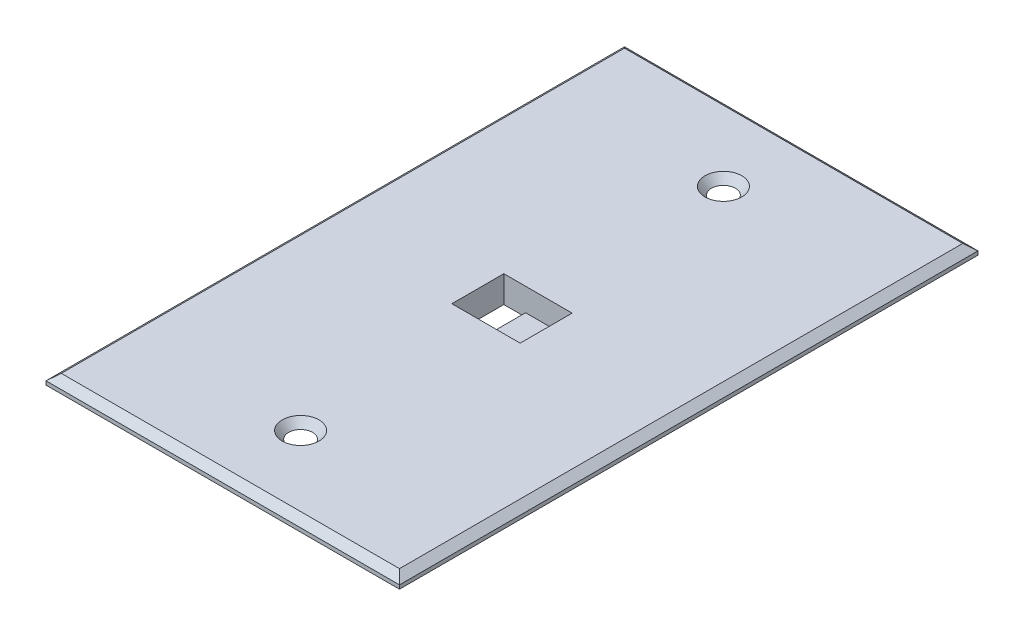
ISO-10303-21;
HEADER;
FILE_DESCRIPTION(('STEP AP214'),'2;1');
FILE_NAME('part.step','',(''),(''),'','','');
FILE_SCHEMA(('AUTOMOTIVE_DESIGN { 1 0 10303 214 1 1 1 1 }'));
ENDSEC;
DATA;
#1=APPLICATION_CONTEXT('core data for automotive mechanical design processes');
#2=APPLICATION_PROTOCOL_DEFINITION('international standard','automotive_design',2000,#1);
#3=PRODUCT_CONTEXT('',#1,'mechanical');
#4=PRODUCT('Part','Part','',(#3));
#5=PRODUCT_RELATED_PRODUCT_CATEGORY('part','',(#4));
#6=PRODUCT_DEFINITION_FORMATION('','',#4);
#7=PRODUCT_DEFINITION_CONTEXT('part definition',#1,'design');
#8=PRODUCT_DEFINITION('design','',#6,#7);
#9=PRODUCT_DEFINITION_SHAPE('','',#8);
#10=(LENGTH_UNIT() NAMED_UNIT(*) SI_UNIT(.MILLI.,.METRE.));
#11=(NAMED_UNIT(*) PLANE_ANGLE_UNIT() SI_UNIT($,.RADIAN.));
#12=(NAMED_UNIT(*) SI_UNIT($,.STERADIAN.) SOLID_ANGLE_UNIT());
#13=UNCERTAINTY_MEASURE_WITH_UNIT(LENGTH_MEASURE(1.E-05),#10,'distance_accuracy_value','');
#14=(GEOMETRIC_REPRESENTATION_CONTEXT(3) GLOBAL_UNCERTAINTY_ASSIGNED_CONTEXT((#13)) GLOBAL_UNIT_ASSIGNED_CONTEXT((#10,
#11,#12)) REPRESENTATION_CONTEXT('',''));
#15=CARTESIAN_POINT('',(0.,0.,0.));
#16=DIRECTION('',(0.,0.,1.));
#17=DIRECTION('',(1.,0.,0.));
#18=AXIS2_PLACEMENT_3D('',#15,#16,#17);
#19=CARTESIAN_POINT('',(6.7,-2.5,-5.1));
#20=DIRECTION('',(1.,0.,0.));
#21=DIRECTION('',(0.,0.,-1.));
#22=AXIS2_PLACEMENT_3D('',#19,#20,#21);
#23=PLANE('',#22);
#24=DIRECTION('',(0.,0.,-1.));
#25=VECTOR('',#24,1.);
#26=CARTESIAN_POINT('',(6.7,2.,-5.1));
#27=LINE('',#26,#25);
#28=CARTESIAN_POINT('',(6.7,2.,5.1));
#29=VERTEX_POINT('',#28);
#30=CARTESIAN_POINT('',(6.7,2.,-5.1));
#31=VERTEX_POINT('',#30);
#32=EDGE_CURVE('E267',#29,#31,#27,.T.);
#33=ORIENTED_EDGE('',*,*,#32,.T.);
#34=DIRECTION('',(0.,1.,0.));
#35=VECTOR('',#34,1.);
#36=CARTESIAN_POINT('',(6.7,-2.5,-5.1));
#37=LINE('',#36,#35);
#38=CARTESIAN_POINT('',(6.7,-2.5,-5.1));
#39=VERTEX_POINT('',#38);
#40=EDGE_CURVE('E284',#39,#31,#37,.T.);
#41=ORIENTED_EDGE('',*,*,#40,.F.);
#42=DIRECTION('',(0.,0.,-1.));
#43=VECTOR('',#42,1.);
#44=CARTESIAN_POINT('',(6.7,-2.5,-5.1));
#45=LINE('',#44,#43);
#46=CARTESIAN_POINT('',(6.7,-2.5,5.1));
#47=VERTEX_POINT('',#46);
#48=EDGE_CURVE('E277',#47,#39,#45,.T.);
#49=ORIENTED_EDGE('',*,*,#48,.F.);
#50=DIRECTION('',(0.,1.,0.));
#51=VECTOR('',#50,1.);
#52=CARTESIAN_POINT('',(6.7,-2.5,5.1));
#53=LINE('',#52,#51);
#54=EDGE_CURVE('E285',#47,#29,#53,.T.);
#55=ORIENTED_EDGE('',*,*,#54,.T.);
#56=EDGE_LOOP('',(#33,#41,#49,#55));
#57=FACE_BOUND('',#56,.T.);
#58=DIRECTION('',(0.,-1.,0.));
#59=VECTOR('',#58,1.);
#60=CARTESIAN_POINT('',(6.7,0.3,-0.637503978051514));
#61=LINE('',#60,#59);
#62=CARTESIAN_POINT('',(6.7,0.96082176619916,-0.637503978051514));
#63=VERTEX_POINT('',#62);
#64=CARTESIAN_POINT('',(6.7,0.299999999999999,-0.637503978051514));
#65=VERTEX_POINT('',#64);
#66=EDGE_CURVE('E230',#63,#65,#61,.T.);
#67=ORIENTED_EDGE('',*,*,#66,.F.);
#68=DIRECTION('',(0.,0.,-1.));
#69=VECTOR('',#68,1.);
#70=CARTESIAN_POINT('',(6.7,0.96082176619916,-0.637503978051514));
#71=LINE('',#70,#69);
#72=CARTESIAN_POINT('',(6.7,0.96082176619916,0.545665972342845));
#73=VERTEX_POINT('',#72);
#74=EDGE_CURVE('E235',#73,#63,#71,.T.);
#75=ORIENTED_EDGE('',*,*,#74,.F.);
#76=DIRECTION('',(0.,1.,0.));
#77=VECTOR('',#76,1.);
#78=CARTESIAN_POINT('',(6.7,0.3,0.545665972342845));
#79=LINE('',#78,#77);
#80=CARTESIAN_POINT('',(6.7,0.3,0.545665972342845));
#81=VERTEX_POINT('',#80);
#82=EDGE_CURVE('E241',#81,#73,#79,.T.);
#83=ORIENTED_EDGE('',*,*,#82,.F.);
#84=DIRECTION('',(0.,0.,1.));
#85=VECTOR('',#84,1.);
#86=CARTESIAN_POINT('',(6.7,0.3,-0.637503978051514));
#87=LINE('',#86,#85);
#88=EDGE_CURVE('E238',#65,#81,#87,.T.);
#89=ORIENTED_EDGE('',*,*,#88,.F.);
#90=EDGE_LOOP('',(#67,#75,#83,#89));
#91=FACE_BOUND('',#90,.T.);
#92=ADVANCED_FACE('F41',(#57,#91),#23,.F.);
#93=CARTESIAN_POINT('',(0.,-2.5,0.));
#94=DIRECTION('',(0.,-1.,0.));
#95=DIRECTION('',(0.,0.,-1.));
#96=AXIS2_PLACEMENT_3D('',#93,#94,#95);
#97=PLANE('',#96);
#98=DIRECTION('',(-1.,0.,0.));
#99=VECTOR('',#98,1.);
#100=CARTESIAN_POINT('',(-6.7,-2.5,-5.1));
#101=LINE('',#100,#99);
#102=CARTESIAN_POINT('',(-2.43682929408481,-2.5,-5.1));
#103=VERTEX_POINT('',#102);
#104=EDGE_CURVE('E280',#39,#103,#101,.T.);
#105=ORIENTED_EDGE('',*,*,#104,.T.);
#106=DIRECTION('',(0.,0.,1.));
#107=VECTOR('',#106,1.);
#108=CARTESIAN_POINT('',(-2.43682929408481,-2.5,0.));
#109=LINE('',#108,#107);
#110=CARTESIAN_POINT('',(-2.43682929408481,-2.5,5.1));
#111=VERTEX_POINT('',#110);
#112=EDGE_CURVE('E208',#103,#111,#109,.T.);
#113=ORIENTED_EDGE('',*,*,#112,.T.);
#114=DIRECTION('',(1.,0.,0.));
#115=VECTOR('',#114,1.);
#116=CARTESIAN_POINT('',(-6.7,-2.5,5.1));
#117=LINE('',#116,#115);
#118=EDGE_CURVE('E282',#111,#47,#117,.T.);
#119=ORIENTED_EDGE('',*,*,#118,.T.);
#120=ORIENTED_EDGE('',*,*,#48,.T.);
#121=EDGE_LOOP('',(#105,#113,#119,#120));
#122=FACE_BOUND('',#121,.T.);
#123=ADVANCED_FACE('F425',(#122),#97,.F.);
#124=CARTESIAN_POINT('',(-34.675,2.,56.75));
#125=DIRECTION('',(0.,0.,-1.));
#126=DIRECTION('',(-1.,0.,0.));
#127=AXIS2_PLACEMENT_3D('',#124,#125,#126);
#128=PLANE('',#127);
#129=DIRECTION('',(0.,-1.,0.));
#130=VECTOR('',#129,1.);
#131=CARTESIAN_POINT('',(34.675,2.,56.75));
#132=LINE('',#131,#130);
#133=CARTESIAN_POINT('',(34.675,0.741350553234083,56.75));
#134=VERTEX_POINT('',#133);
#135=CARTESIAN_POINT('',(34.675,0.,56.75));
#136=VERTEX_POINT('',#135);
#137=EDGE_CURVE('E362',#134,#136,#132,.T.);
#138=ORIENTED_EDGE('',*,*,#137,.F.);
#139=DIRECTION('',(-1.,0.,0.));
#140=VECTOR('',#139,1.);
#141=CARTESIAN_POINT('',(-34.675,0.741350553234083,56.75));
#142=LINE('',#141,#140);
#143=CARTESIAN_POINT('',(-34.675,0.741350553234083,56.75));
#144=VERTEX_POINT('',#143);
#145=EDGE_CURVE('E384',#134,#144,#142,.T.);
#146=ORIENTED_EDGE('',*,*,#145,.T.);
#147=DIRECTION('',(0.,-1.,0.));
#148=VECTOR('',#147,1.);
#149=CARTESIAN_POINT('',(-34.675,2.,56.75));
#150=LINE('',#149,#148);
#151=CARTESIAN_POINT('',(-34.675,0.,56.75));
#152=VERTEX_POINT('',#151);
#153=EDGE_CURVE('E356',#144,#152,#150,.T.);
#154=ORIENTED_EDGE('',*,*,#153,.T.);
#155=DIRECTION('',(1.,0.,0.));
#156=VECTOR('',#155,1.);
#157=CARTESIAN_POINT('',(-34.675,0.,56.75));
#158=LINE('',#157,#156);
#159=EDGE_CURVE('E343',#152,#136,#158,.T.);
#160=ORIENTED_EDGE('',*,*,#159,.T.);
#161=EDGE_LOOP('',(#138,#146,#154,#160));
#162=FACE_BOUND('',#161,.T.);
#163=ADVANCED_FACE('F431',(#162),#128,.F.);
#164=CARTESIAN_POINT('',(34.675,2.,-56.75));
#165=DIRECTION('',(1.,0.,0.));
#166=DIRECTION('',(0.,0.,-1.));
#167=AXIS2_PLACEMENT_3D('',#164,#165,#166);
#168=PLANE('',#167);
#169=DIRECTION('',(0.,-1.,0.));
#170=VECTOR('',#169,1.);
#171=CARTESIAN_POINT('',(34.675,2.,-56.75));
#172=LINE('',#171,#170);
#173=CARTESIAN_POINT('',(34.675,0.741350553234083,-56.75));
#174=VERTEX_POINT('',#173);
#175=CARTESIAN_POINT('',(34.675,0.,-56.75));
#176=VERTEX_POINT('',#175);
#177=EDGE_CURVE('E360',#174,#176,#172,.T.);
#178=ORIENTED_EDGE('',*,*,#177,.F.);
#179=DIRECTION('',(0.,0.,1.));
#180=VECTOR('',#179,1.);
#181=CARTESIAN_POINT('',(34.675,0.741350553234083,56.75));
#182=LINE('',#181,#180);
#183=EDGE_CURVE('E382',#174,#134,#182,.T.);
#184=ORIENTED_EDGE('',*,*,#183,.T.);
#185=ORIENTED_EDGE('',*,*,#137,.T.);
#186=DIRECTION('',(0.,0.,1.));
#187=VECTOR('',#186,1.);
#188=CARTESIAN_POINT('',(34.675,0.,-56.75));
#189=LINE('',#188,#187);
#190=EDGE_CURVE('E346',#176,#136,#189,.T.);
#191=ORIENTED_EDGE('',*,*,#190,.F.);
#192=EDGE_LOOP('',(#178,#184,#185,#191));
#193=FACE_BOUND('',#192,.T.);
#194=ADVANCED_FACE('F491',(#193),#168,.T.);
#195=CARTESIAN_POINT('',(-34.675,2.,-56.75));
#196=DIRECTION('',(0.,0.,-1.));
#197=DIRECTION('',(-1.,0.,0.));
#198=AXIS2_PLACEMENT_3D('',#195,#196,#197);
#199=PLANE('',#198);
#200=DIRECTION('',(0.,-1.,0.));
#201=VECTOR('',#200,1.);
#202=CARTESIAN_POINT('',(-34.675,2.,-56.75));
#203=LINE('',#202,#201);
#204=CARTESIAN_POINT('',(-34.675,0.741350553234083,-56.75));
#205=VERTEX_POINT('',#204);
#206=CARTESIAN_POINT('',(-34.675,0.,-56.75));
#207=VERTEX_POINT('',#206);
#208=EDGE_CURVE('E358',#205,#207,#203,.T.);
#209=ORIENTED_EDGE('',*,*,#208,.F.);
#210=DIRECTION('',(1.,0.,0.));
#211=VECTOR('',#210,1.);
#212=CARTESIAN_POINT('',(34.675,0.741350553234083,-56.75));
#213=LINE('',#212,#211);
#214=EDGE_CURVE('E379',#205,#174,#213,.T.);
#215=ORIENTED_EDGE('',*,*,#214,.T.);
#216=ORIENTED_EDGE('',*,*,#177,.T.);
#217=DIRECTION('',(1.,0.,0.));
#218=VECTOR('',#217,1.);
#219=CARTESIAN_POINT('',(-34.675,0.,-56.75));
#220=LINE('',#219,#218);
#221=EDGE_CURVE('E350',#207,#176,#220,.T.);
#222=ORIENTED_EDGE('',*,*,#221,.F.);
#223=EDGE_LOOP('',(#209,#215,#216,#222));
#224=FACE_BOUND('',#223,.T.);
#225=ADVANCED_FACE('F487',(#224),#199,.T.);
#226=CARTESIAN_POINT('',(-34.675,2.,-56.75));
#227=DIRECTION('',(1.,0.,0.));
#228=DIRECTION('',(0.,0.,-1.));
#229=AXIS2_PLACEMENT_3D('',#226,#227,#228);
#230=PLANE('',#229);
#231=ORIENTED_EDGE('',*,*,#153,.F.);
#232=DIRECTION('',(0.,0.,-1.));
#233=VECTOR('',#232,1.);
#234=CARTESIAN_POINT('',(-34.675,0.741350553234083,-56.75));
#235=LINE('',#234,#233);
#236=EDGE_CURVE('E386',#144,#205,#235,.T.);
#237=ORIENTED_EDGE('',*,*,#236,.T.);
#238=ORIENTED_EDGE('',*,*,#208,.T.);
#239=DIRECTION('',(0.,0.,1.));
#240=VECTOR('',#239,1.);
#241=CARTESIAN_POINT('',(-34.675,0.,-56.75));
#242=LINE('',#241,#240);
#243=EDGE_CURVE('E353',#207,#152,#242,.T.);
#244=ORIENTED_EDGE('',*,*,#243,.T.);
#245=EDGE_LOOP('',(#231,#237,#238,#244));
#246=FACE_BOUND('',#245,.T.);
#247=ADVANCED_FACE('F479',(#246),#230,.F.);
#248=CARTESIAN_POINT('',(0.,2.,0.));
#249=DIRECTION('',(0.,-1.,0.));
#250=DIRECTION('',(0.,0.,-1.));
#251=AXIS2_PLACEMENT_3D('',#248,#249,#250);
#252=PLANE('',#251);
#253=DIRECTION('',(-1.,0.,0.));
#254=VECTOR('',#253,1.);
#255=CARTESIAN_POINT('',(-6.7,2.,-5.1));
#256=LINE('',#255,#254);
#257=CARTESIAN_POINT('',(-6.7,2.,-5.1));
#258=VERTEX_POINT('',#257);
#259=EDGE_CURVE('E270',#31,#258,#256,.T.);
#260=ORIENTED_EDGE('',*,*,#259,.F.);
#261=ORIENTED_EDGE('',*,*,#32,.F.);
#262=DIRECTION('',(1.,0.,0.));
#263=VECTOR('',#262,1.);
#264=CARTESIAN_POINT('',(-6.7,2.,5.1));
#265=LINE('',#264,#263);
#266=CARTESIAN_POINT('',(-6.7,2.,5.1));
#267=VERTEX_POINT('',#266);
#268=EDGE_CURVE('E275',#267,#29,#265,.T.);
#269=ORIENTED_EDGE('',*,*,#268,.F.);
#270=DIRECTION('',(0.,0.,1.));
#271=VECTOR('',#270,1.);
#272=CARTESIAN_POINT('',(-6.7,2.,-5.1));
#273=LINE('',#272,#271);
#274=EDGE_CURVE('E272',#258,#267,#273,.T.);
#275=ORIENTED_EDGE('',*,*,#274,.F.);
#276=EDGE_LOOP('',(#260,#261,#269,#275));
#277=FACE_BOUND('',#276,.T.);
#278=CARTESIAN_POINT('',(0.,2.,41.4760026959192));
#279=DIRECTION('',(0.,-1.,0.));
#280=DIRECTION('',(0.,0.,-1.));
#281=AXIS2_PLACEMENT_3D('',#278,#279,#280);
#282=CIRCLE('',#281,3.60864944676592);
#283=CARTESIAN_POINT('',(0.,2.,45.0846521426851));
#284=VERTEX_POINT('',#283);
#285=EDGE_CURVE('E376',#284,#284,#282,.T.);
#286=ORIENTED_EDGE('',*,*,#285,.T.);
#287=EDGE_LOOP('',(#286));
#288=FACE_BOUND('',#287,.T.);
#289=CARTESIAN_POINT('',(0.,2.,-41.4760026959192));
#290=DIRECTION('',(0.,-1.,0.));
#291=DIRECTION('',(0.,0.,-1.));
#292=AXIS2_PLACEMENT_3D('',#289,#290,#291);
#293=CIRCLE('',#292,3.60864944676592);
#294=CARTESIAN_POINT('',(0.,2.,-37.8673532491533));
#295=VERTEX_POINT('',#294);
#296=EDGE_CURVE('E373',#295,#295,#293,.T.);
#297=ORIENTED_EDGE('',*,*,#296,.T.);
#298=EDGE_LOOP('',(#297));
#299=FACE_BOUND('',#298,.T.);
#300=DIRECTION('',(0.,0.,-1.));
#301=VECTOR('',#300,1.);
#302=CARTESIAN_POINT('',(33.175,2.,-56.75));
#303=LINE('',#302,#301);
#304=CARTESIAN_POINT('',(33.175,2.,55.25));
#305=VERTEX_POINT('',#304);
#306=CARTESIAN_POINT('',(33.175,2.,-55.25));
#307=VERTEX_POINT('',#306);
#308=EDGE_CURVE('E368',#305,#307,#303,.T.);
#309=ORIENTED_EDGE('',*,*,#308,.T.);
#310=DIRECTION('',(-1.,0.,0.));
#311=VECTOR('',#310,1.);
#312=CARTESIAN_POINT('',(-34.675,2.,-55.25));
#313=LINE('',#312,#311);
#314=CARTESIAN_POINT('',(-33.175,2.,-55.25));
#315=VERTEX_POINT('',#314);
#316=EDGE_CURVE('E370',#307,#315,#313,.T.);
#317=ORIENTED_EDGE('',*,*,#316,.T.);
#318=DIRECTION('',(0.,0.,1.));
#319=VECTOR('',#318,1.);
#320=CARTESIAN_POINT('',(-33.175,2.,0.));
#321=LINE('',#320,#319);
#322=CARTESIAN_POINT('',(-33.175,2.,55.25));
#323=VERTEX_POINT('',#322);
#324=EDGE_CURVE('E364',#315,#323,#321,.T.);
#325=ORIENTED_EDGE('',*,*,#324,.T.);
#326=DIRECTION('',(1.,0.,0.));
#327=VECTOR('',#326,1.);
#328=CARTESIAN_POINT('',(0.,2.,55.25));
#329=LINE('',#328,#327);
#330=EDGE_CURVE('E366',#323,#305,#329,.T.);
#331=ORIENTED_EDGE('',*,*,#330,.T.);
#332=EDGE_LOOP('',(#309,#317,#325,#331));
#333=FACE_BOUND('',#332,.T.);
#334=ADVANCED_FACE('F475',(#277,#288,#299,#333),#252,.F.);
#335=CARTESIAN_POINT('',(0.,0.,0.));
#336=DIRECTION('',(0.,-1.,0.));
#337=DIRECTION('',(0.,0.,-1.));
#338=AXIS2_PLACEMENT_3D('',#335,#336,#337);
#339=PLANE('',#338);
#340=DIRECTION('',(0.,0.,-1.));
#341=VECTOR('',#340,1.);
#342=CARTESIAN_POINT('',(-30.1192080439515,0.,-45.2572475035417));
#343=LINE('',#342,#341);
#344=CARTESIAN_POINT('',(-30.1192080439515,0.,45.2572475035417));
#345=VERTEX_POINT('',#344);
#346=CARTESIAN_POINT('',(-30.1192080439515,0.,-45.2572475035417));
#347=VERTEX_POINT('',#346);
#348=EDGE_CURVE('E296',#345,#347,#343,.T.);
#349=ORIENTED_EDGE('',*,*,#348,.F.);
#350=DIRECTION('',(-1.,0.,0.));
#351=VECTOR('',#350,1.);
#352=CARTESIAN_POINT('',(30.1192080439515,0.,45.2572475035417));
#353=LINE('',#352,#351);
#354=CARTESIAN_POINT('',(30.1192080439515,0.,45.2572475035417));
#355=VERTEX_POINT('',#354);
#356=EDGE_CURVE('E309',#355,#345,#353,.T.);
#357=ORIENTED_EDGE('',*,*,#356,.F.);
#358=DIRECTION('',(0.,0.,1.));
#359=VECTOR('',#358,1.);
#360=CARTESIAN_POINT('',(30.1192080439515,0.,-45.2572475035417));
#361=LINE('',#360,#359);
#362=CARTESIAN_POINT('',(30.1192080439515,0.,-45.2572475035417));
#363=VERTEX_POINT('',#362);
#364=EDGE_CURVE('E323',#363,#355,#361,.T.);
#365=ORIENTED_EDGE('',*,*,#364,.F.);
#366=DIRECTION('',(1.,0.,0.));
#367=VECTOR('',#366,1.);
#368=CARTESIAN_POINT('',(30.1192080439515,0.,-45.2572475035417));
#369=LINE('',#368,#367);
#370=EDGE_CURVE('E320',#347,#363,#369,.T.);
#371=ORIENTED_EDGE('',*,*,#370,.F.);
#372=EDGE_LOOP('',(#349,#357,#365,#371));
#373=FACE_BOUND('',#372,.T.);
#374=ORIENTED_EDGE('',*,*,#159,.F.);
#375=ORIENTED_EDGE('',*,*,#243,.F.);
#376=ORIENTED_EDGE('',*,*,#221,.T.);
#377=ORIENTED_EDGE('',*,*,#190,.T.);
#378=EDGE_LOOP('',(#374,#375,#376,#377));
#379=FACE_BOUND('',#378,.T.);
#380=ADVANCED_FACE('F478',(#373,#379),#339,.T.);
#381=CARTESIAN_POINT('',(0.,0.499999999999984,41.4760026959192));
#382=DIRECTION('',(0.,1.,0.));
#383=DIRECTION('',(0.,0.,1.));
#384=AXIS2_PLACEMENT_3D('',#381,#382,#383);
#385=CONICAL_SURFACE('',#384,2.35,0.698131700797728);
#386=CARTESIAN_POINT('',(0.,0.5,41.4760026959192));
#387=DIRECTION('',(0.,-1.,0.));
#388=DIRECTION('',(0.,0.,-1.));
#389=AXIS2_PLACEMENT_3D('',#386,#387,#388);
#390=CIRCLE('',#389,2.35000000000001);
#391=CARTESIAN_POINT('',(0.,0.5,43.8260026959192));
#392=VERTEX_POINT('',#391);
#393=EDGE_CURVE('E339',#392,#392,#390,.T.);
#394=CARTESIAN_POINT('',(0.,2.,45.0846521426851));
#395=CARTESIAN_POINT('',(0.,1.984375,45.071541210948));
#396=CARTESIAN_POINT('',(0.,1.96875,45.0584302792108));
#397=CARTESIAN_POINT('',(0.,1.9375,45.0322084157366));
#398=CARTESIAN_POINT('',(0.,1.921875,45.0190974839994));
#399=CARTESIAN_POINT('',(0.,1.890625,44.9928756205251));
#400=CARTESIAN_POINT('',(0.,1.875,44.979764688788));
#401=CARTESIAN_POINT('',(0.,1.84375,44.9535428253137));
#402=CARTESIAN_POINT('',(0.,1.828125,44.9404318935765));
#403=CARTESIAN_POINT('',(0.,1.796875,44.9142100301023));
#404=CARTESIAN_POINT('',(0.,1.78125,44.9010990983651));
#405=CARTESIAN_POINT('',(0.,1.75,44.8748772348908));
#406=CARTESIAN_POINT('',(0.,1.734375,44.8617663031537));
#407=CARTESIAN_POINT('',(0.,1.703125,44.8355444396794));
#408=CARTESIAN_POINT('',(0.,1.6875,44.8224335079422));
#409=CARTESIAN_POINT('',(0.,1.65625,44.796211644468));
#410=CARTESIAN_POINT('',(0.,1.640625,44.7831007127308));
#411=CARTESIAN_POINT('',(0.,1.609375,44.7568788492565));
#412=CARTESIAN_POINT('',(0.,1.59375,44.7437679175194));
#413=CARTESIAN_POINT('',(0.,1.5625,44.7175460540451));
#414=CARTESIAN_POINT('',(0.,1.546875,44.7044351223079));
#415=CARTESIAN_POINT('',(0.,1.515625,44.6782132588337));
#416=CARTESIAN_POINT('',(0.,1.5,44.6651023270965));
#417=CARTESIAN_POINT('',(0.,1.46875,44.6388804636222));
#418=CARTESIAN_POINT('',(0.,1.453125,44.6257695318851));
#419=CARTESIAN_POINT('',(0.,1.421875,44.5995476684108));
#420=CARTESIAN_POINT('',(0.,1.40625,44.5864367366736));
#421=CARTESIAN_POINT('',(0.,1.375,44.5602148731993));
#422=CARTESIAN_POINT('',(0.,1.359375,44.5471039414622));
#423=CARTESIAN_POINT('',(0.,1.328125,44.5208820779879));
#424=CARTESIAN_POINT('',(0.,1.3125,44.5077711462508));
#425=CARTESIAN_POINT('',(0.,1.28125,44.4815492827765));
#426=CARTESIAN_POINT('',(0.,1.265625,44.4684383510393));
#427=CARTESIAN_POINT('',(0.,1.234375,44.442216487565));
#428=CARTESIAN_POINT('',(0.,1.21875,44.4291055558279));
#429=CARTESIAN_POINT('',(0.,1.1875,44.4028836923536));
#430=CARTESIAN_POINT('',(0.,1.171875,44.3897727606165));
#431=CARTESIAN_POINT('',(0.,1.140625,44.3635508971422));
#432=CARTESIAN_POINT('',(0.,1.125,44.350439965405));
#433=CARTESIAN_POINT('',(0.,1.09375,44.3242181019307));
#434=CARTESIAN_POINT('',(0.,1.078125,44.3111071701936));
#435=CARTESIAN_POINT('',(0.,1.046875,44.2848853067193));
#436=CARTESIAN_POINT('',(0.,1.03125,44.2717743749822));
#437=CARTESIAN_POINT('',(0.,1.,44.2455525115079));
#438=CARTESIAN_POINT('',(0.,0.984375,44.2324415797707));
#439=CARTESIAN_POINT('',(0.,0.953125,44.2062197162964));
#440=CARTESIAN_POINT('',(0.,0.9375,44.1931087845593));
#441=CARTESIAN_POINT('',(0.,0.90625,44.166886921085));
#442=CARTESIAN_POINT('',(0.,0.890625,44.1537759893478));
#443=CARTESIAN_POINT('',(0.,0.859375,44.1275541258736));
#444=CARTESIAN_POINT('',(0.,0.84375,44.1144431941364));
#445=CARTESIAN_POINT('',(0.,0.8125,44.0882213306621));
#446=CARTESIAN_POINT('',(0.,0.796875,44.075110398925));
#447=CARTESIAN_POINT('',(0.,0.765625,44.0488885354507));
#448=CARTESIAN_POINT('',(0.,0.75,44.0357776037135));
#449=CARTESIAN_POINT('',(0.,0.71875,44.0095557402393));
#450=CARTESIAN_POINT('',(0.,0.703125,43.9964448085021));
#451=CARTESIAN_POINT('',(0.,0.671875,43.9702229450278));
#452=CARTESIAN_POINT('',(0.,0.65625,43.9571120132907));
#453=CARTESIAN_POINT('',(0.,0.625,43.9308901498164));
#454=CARTESIAN_POINT('',(0.,0.609375,43.9177792180792));
#455=CARTESIAN_POINT('',(0.,0.578125,43.891557354605));
#456=CARTESIAN_POINT('',(0.,0.5625,43.8784464228678));
#457=CARTESIAN_POINT('',(0.,0.53125,43.8522245593935));
#458=CARTESIAN_POINT('',(0.,0.515625,43.8391136276564));
#459=CARTESIAN_POINT('',(0.,0.5,43.8260026959192));
#460=B_SPLINE_CURVE_WITH_KNOTS('',3,(#394,#395,#396,#397,#398,#399,#400,#401,#402,#403,#404,
#405,#406,#407,#408,#409,#410,#411,#412,#413,#414,#415,#416,#417,#418,#419,#420,#421,#422,#423,
#424,#425,#426,#427,#428,#429,#430,#431,#432,#433,#434,#435,#436,#437,#438,#439,#440,#441,#442,
#443,#444,#445,#446,#447,#448,#449,#450,#451,#452,#453,#454,#455,#456,#457,#458,#459),
.UNSPECIFIED.,.F.,.F.,(4,2,2,2,2,2,2,2,2,2,2,2,2,2,2,2,2,2,2,2,2,2,2,2,2,2,2,2,2,2,2,2,4),(0.,
0.0611909666874502,0.1223819333749,0.183572900062351,0.244763866749801,0.305954833437251,
0.367145800124701,0.428336766812151,0.489527733499602,0.550718700187052,0.611909666874502,
0.673100633561952,0.734291600249402,0.795482566936853,0.856673533624307,0.917864500311757,
0.979055466999208,1.04024643368666,1.10143740037411,1.16262836706156,1.22381933374901,
1.28501030043646,1.34620126712391,1.40739223381136,1.46858320049881,1.52977416718626,
1.59096513387371,1.65215610056116,1.71334706724861,1.77453803393606,1.83572900062351,
1.89691996731096,1.95811093399841),.UNSPECIFIED.);
#461=EDGE_CURVE('BSEAM483',#284,#392,#460,.T.);
#462=ORIENTED_EDGE('',*,*,#285,.F.);
#463=ORIENTED_EDGE('',*,*,#393,.T.);
#464=ORIENTED_EDGE('',*,*,#461,.T.);
#465=ORIENTED_EDGE('',*,*,#461,.F.);
#466=EDGE_LOOP('',(#462,#464,#463,#465));
#467=FACE_BOUND('',#466,.T.);
#468=ADVANCED_FACE('F483',(#467),#385,.F.);
#469=CARTESIAN_POINT('',(0.,0.499999999999984,-41.4760026959192));
#470=DIRECTION('',(0.,1.,0.));
#471=DIRECTION('',(0.,0.,1.));
#472=AXIS2_PLACEMENT_3D('',#469,#470,#471);
#473=CONICAL_SURFACE('',#472,2.35,0.698131700797728);
#474=CARTESIAN_POINT('',(0.,0.5,-41.4760026959192));
#475=DIRECTION('',(0.,-1.,0.));
#476=DIRECTION('',(0.,0.,-1.));
#477=AXIS2_PLACEMENT_3D('',#474,#475,#476);
#478=CIRCLE('',#477,2.35000000000001);
#479=CARTESIAN_POINT('',(0.,0.5,-39.1260026959192));
#480=VERTEX_POINT('',#479);
#481=EDGE_CURVE('E330',#480,#480,#478,.T.);
#482=CARTESIAN_POINT('',(0.,2.,-37.8673532491533));
#483=CARTESIAN_POINT('',(0.,1.984375,-37.8804641808905));
#484=CARTESIAN_POINT('',(0.,1.96875,-37.8935751126276));
#485=CARTESIAN_POINT('',(0.,1.9375,-37.9197969761019));
#486=CARTESIAN_POINT('',(0.,1.921875,-37.9329079078391));
#487=CARTESIAN_POINT('',(0.,1.890625,-37.9591297713133));
#488=CARTESIAN_POINT('',(0.,1.875,-37.9722407030505));
#489=CARTESIAN_POINT('',(0.,1.84375,-37.9984625665248));
#490=CARTESIAN_POINT('',(0.,1.828125,-38.0115734982619));
#491=CARTESIAN_POINT('',(0.,1.796875,-38.0377953617362));
#492=CARTESIAN_POINT('',(0.,1.78125,-38.0509062934734));
#493=CARTESIAN_POINT('',(0.,1.75,-38.0771281569476));
#494=CARTESIAN_POINT('',(0.,1.734375,-38.0902390886848));
#495=CARTESIAN_POINT('',(0.,1.703125,-38.1164609521591));
#496=CARTESIAN_POINT('',(0.,1.6875,-38.1295718838962));
#497=CARTESIAN_POINT('',(0.,1.65625,-38.1557937473705));
#498=CARTESIAN_POINT('',(0.,1.640625,-38.1689046791077));
#499=CARTESIAN_POINT('',(0.,1.609375,-38.1951265425819));
#500=CARTESIAN_POINT('',(0.,1.59375,-38.2082374743191));
#501=CARTESIAN_POINT('',(0.,1.5625,-38.2344593377934));
#502=CARTESIAN_POINT('',(0.,1.546875,-38.2475702695305));
#503=CARTESIAN_POINT('',(0.,1.515625,-38.2737921330048));
#504=CARTESIAN_POINT('',(0.,1.5,-38.286903064742));
#505=CARTESIAN_POINT('',(0.,1.46875,-38.3131249282162));
#506=CARTESIAN_POINT('',(0.,1.453125,-38.3262358599534));
#507=CARTESIAN_POINT('',(0.,1.421875,-38.3524577234277));
#508=CARTESIAN_POINT('',(0.,1.40625,-38.3655686551648));
#509=CARTESIAN_POINT('',(0.,1.375,-38.3917905186391));
#510=CARTESIAN_POINT('',(0.,1.359375,-38.4049014503763));
#511=CARTESIAN_POINT('',(0.,1.328125,-38.4311233138506));
#512=CARTESIAN_POINT('',(0.,1.3125,-38.4442342455877));
#513=CARTESIAN_POINT('',(0.,1.28125,-38.470456109062));
#514=CARTESIAN_POINT('',(0.,1.265625,-38.4835670407991));
#515=CARTESIAN_POINT('',(0.,1.234375,-38.5097889042734));
#516=CARTESIAN_POINT('',(0.,1.21875,-38.5228998360106));
#517=CARTESIAN_POINT('',(0.,1.1875,-38.5491216994849));
#518=CARTESIAN_POINT('',(0.,1.171875,-38.562232631222));
#519=CARTESIAN_POINT('',(0.,1.140625,-38.5884544946963));
#520=CARTESIAN_POINT('',(0.,1.125,-38.6015654264334));
#521=CARTESIAN_POINT('',(0.,1.09375,-38.6277872899077));
#522=CARTESIAN_POINT('',(0.,1.078125,-38.6408982216449));
#523=CARTESIAN_POINT('',(0.,1.046875,-38.6671200851192));
#524=CARTESIAN_POINT('',(0.,1.03125,-38.6802310168563));
#525=CARTESIAN_POINT('',(0.,1.,-38.7064528803306));
#526=CARTESIAN_POINT('',(0.,0.984375,-38.7195638120677));
#527=CARTESIAN_POINT('',(0.,0.953125,-38.745785675542));
#528=CARTESIAN_POINT('',(0.,0.9375,-38.7588966072792));
#529=CARTESIAN_POINT('',(0.,0.90625,-38.7851184707535));
#530=CARTESIAN_POINT('',(0.,0.890625,-38.7982294024906));
#531=CARTESIAN_POINT('',(0.,0.859375,-38.8244512659649));
#532=CARTESIAN_POINT('',(0.,0.84375,-38.837562197702));
#533=CARTESIAN_POINT('',(0.,0.8125,-38.8637840611763));
#534=CARTESIAN_POINT('',(0.,0.796875,-38.8768949929135));
#535=CARTESIAN_POINT('',(0.,0.765625,-38.9031168563878));
#536=CARTESIAN_POINT('',(0.,0.75,-38.9162277881249));
#537=CARTESIAN_POINT('',(0.,0.71875,-38.9424496515992));
#538=CARTESIAN_POINT('',(0.,0.703125,-38.9555605833364));
#539=CARTESIAN_POINT('',(0.,0.671875,-38.9817824468106));
#540=CARTESIAN_POINT('',(0.,0.65625,-38.9948933785478));
#541=CARTESIAN_POINT('',(0.,0.625,-39.0211152420221));
#542=CARTESIAN_POINT('',(0.,0.609375,-39.0342261737592));
#543=CARTESIAN_POINT('',(0.,0.578125,-39.0604480372335));
#544=CARTESIAN_POINT('',(0.,0.5625,-39.0735589689707));
#545=CARTESIAN_POINT('',(0.,0.53125,-39.0997808324449));
#546=CARTESIAN_POINT('',(0.,0.515625,-39.1128917641821));
#547=CARTESIAN_POINT('',(0.,0.5,-39.1260026959192));
#548=B_SPLINE_CURVE_WITH_KNOTS('',3,(#482,#483,#484,#485,#486,#487,#488,#489,#490,#491,#492,
#493,#494,#495,#496,#497,#498,#499,#500,#501,#502,#503,#504,#505,#506,#507,#508,#509,#510,#511,
#512,#513,#514,#515,#516,#517,#518,#519,#520,#521,#522,#523,#524,#525,#526,#527,#528,#529,#530,
#531,#532,#533,#534,#535,#536,#537,#538,#539,#540,#541,#542,#543,#544,#545,#546,#547),
.UNSPECIFIED.,.F.,.F.,(4,2,2,2,2,2,2,2,2,2,2,2,2,2,2,2,2,2,2,2,2,2,2,2,2,2,2,2,2,2,2,2,4),(0.,
0.0611909666874502,0.1223819333749,0.183572900062351,0.244763866749801,0.305954833437251,
0.367145800124701,0.428336766812151,0.489527733499602,0.550718700187052,0.611909666874502,
0.673100633561952,0.734291600249402,0.795482566936853,0.856673533624307,0.917864500311757,
0.979055466999208,1.04024643368666,1.10143740037411,1.16262836706156,1.22381933374901,
1.28501030043646,1.34620126712391,1.40739223381136,1.46858320049881,1.52977416718626,
1.59096513387371,1.65215610056116,1.71334706724861,1.77453803393606,1.83572900062351,
1.89691996731096,1.95811093399841),.UNSPECIFIED.);
#549=EDGE_CURVE('BSEAM505',#295,#480,#548,.T.);
#550=ORIENTED_EDGE('',*,*,#296,.F.);
#551=ORIENTED_EDGE('',*,*,#481,.T.);
#552=ORIENTED_EDGE('',*,*,#549,.T.);
#553=ORIENTED_EDGE('',*,*,#549,.F.);
#554=EDGE_LOOP('',(#550,#552,#551,#553));
#555=FACE_BOUND('',#554,.T.);
#556=ADVANCED_FACE('F505',(#555),#473,.F.);
#557=CARTESIAN_POINT('',(0.,2.,55.25));
#558=DIRECTION('',(0.,-0.766044443118979,-0.642787609686538));
#559=DIRECTION('',(1.,0.,0.));
#560=AXIS2_PLACEMENT_3D('',#557,#558,#559);
#561=PLANE('',#560);
#562=DIRECTION('',(0.608120402411343,-0.510273605374736,0.608120402411343));
#563=VECTOR('',#562,1.);
#564=CARTESIAN_POINT('',(20.9065391894751,12.2944609412243,42.9815391894751));
#565=LINE('',#564,#563);
#566=EDGE_CURVE('E392',#305,#134,#565,.T.);
#567=ORIENTED_EDGE('',*,*,#566,.F.);
#568=ORIENTED_EDGE('',*,*,#330,.F.);
#569=DIRECTION('',(0.608120402411343,0.510273605374736,-0.608120402411344));
#570=VECTOR('',#569,1.);
#571=CARTESIAN_POINT('',(-12.7429740834514,19.1445054107805,34.8179740834514));
#572=LINE('',#571,#570);
#573=EDGE_CURVE('E347',#144,#323,#572,.T.);
#574=ORIENTED_EDGE('',*,*,#573,.F.);
#575=ORIENTED_EDGE('',*,*,#145,.F.);
#576=EDGE_LOOP('',(#567,#568,#574,#575));
#577=FACE_BOUND('',#576,.T.);
#578=ADVANCED_FACE('F512',(#577),#561,.F.);
#579=CARTESIAN_POINT('',(-33.175,2.,0.));
#580=DIRECTION('',(0.642787609686538,-0.766044443118979,0.));
#581=DIRECTION('',(0.,0.,1.));
#582=AXIS2_PLACEMENT_3D('',#579,#580,#581);
#583=PLANE('',#582);
#584=ORIENTED_EDGE('',*,*,#573,.T.);
#585=ORIENTED_EDGE('',*,*,#324,.F.);
#586=DIRECTION('',(0.608120402411343,0.510273605374736,0.608120402411343));
#587=VECTOR('',#586,1.);
#588=CARTESIAN_POINT('',(-12.7429740834514,19.1445054107805,-34.8179740834514));
#589=LINE('',#588,#587);
#590=EDGE_CURVE('E390',#205,#315,#589,.T.);
#591=ORIENTED_EDGE('',*,*,#590,.F.);
#592=ORIENTED_EDGE('',*,*,#236,.F.);
#593=EDGE_LOOP('',(#584,#585,#591,#592));
#594=FACE_BOUND('',#593,.T.);
#595=ADVANCED_FACE('F527',(#594),#583,.F.);
#596=CARTESIAN_POINT('',(34.675,0.741350553234083,-56.75));
#597=DIRECTION('',(0.642787609686538,0.766044443118979,0.));
#598=DIRECTION('',(0.,0.,-1.));
#599=AXIS2_PLACEMENT_3D('',#596,#597,#598);
#600=PLANE('',#599);
#601=ORIENTED_EDGE('',*,*,#566,.T.);
#602=ORIENTED_EDGE('',*,*,#183,.F.);
#603=DIRECTION('',(-0.608120402411343,0.510273605374736,0.608120402411344));
#604=VECTOR('',#603,1.);
#605=CARTESIAN_POINT('',(34.675,0.741350553234083,-56.75));
#606=LINE('',#605,#604);
#607=EDGE_CURVE('E342',#307,#174,#606,.F.);
#608=ORIENTED_EDGE('',*,*,#607,.F.);
#609=ORIENTED_EDGE('',*,*,#308,.F.);
#610=EDGE_LOOP('',(#601,#602,#608,#609));
#611=FACE_BOUND('',#610,.T.);
#612=ADVANCED_FACE('F520',(#611),#600,.T.);
#613=CARTESIAN_POINT('',(-34.675,0.741350553234083,-56.75));
#614=DIRECTION('',(0.,0.766044443118979,-0.642787609686538));
#615=DIRECTION('',(-1.,0.,0.));
#616=AXIS2_PLACEMENT_3D('',#613,#614,#615);
#617=PLANE('',#616);
#618=ORIENTED_EDGE('',*,*,#590,.T.);
#619=ORIENTED_EDGE('',*,*,#316,.F.);
#620=ORIENTED_EDGE('',*,*,#607,.T.);
#621=ORIENTED_EDGE('',*,*,#214,.F.);
#622=EDGE_LOOP('',(#618,#619,#620,#621));
#623=FACE_BOUND('',#622,.T.);
#624=ADVANCED_FACE('F473',(#623),#617,.T.);
#625=CARTESIAN_POINT('',(-30.1192080439515,0.5,-45.2572475035417));
#626=DIRECTION('',(-1.,0.,0.));
#627=DIRECTION('',(0.,0.,1.));
#628=AXIS2_PLACEMENT_3D('',#625,#626,#627);
#629=PLANE('',#628);
#630=ORIENTED_EDGE('',*,*,#348,.T.);
#631=DIRECTION('',(0.,-1.,0.));
#632=VECTOR('',#631,1.);
#633=CARTESIAN_POINT('',(-30.1192080439515,0.5,-45.2572475035417));
#634=LINE('',#633,#632);
#635=CARTESIAN_POINT('',(-30.1192080439515,0.5,-45.2572475035417));
#636=VERTEX_POINT('',#635);
#637=EDGE_CURVE('E318',#636,#347,#634,.T.);
#638=ORIENTED_EDGE('',*,*,#637,.F.);
#639=DIRECTION('',(0.,0.,-1.));
#640=VECTOR('',#639,1.);
#641=CARTESIAN_POINT('',(-30.1192080439515,0.5,-45.2572475035417));
#642=LINE('',#641,#640);
#643=CARTESIAN_POINT('',(-30.1192080439515,0.5,45.2572475035417));
#644=VERTEX_POINT('',#643);
#645=EDGE_CURVE('E305',#644,#636,#642,.T.);
#646=ORIENTED_EDGE('',*,*,#645,.F.);
#647=DIRECTION('',(0.,-1.,0.));
#648=VECTOR('',#647,1.);
#649=CARTESIAN_POINT('',(-30.1192080439515,0.5,45.2572475035417));
#650=LINE('',#649,#648);
#651=EDGE_CURVE('E328',#644,#345,#650,.T.);
#652=ORIENTED_EDGE('',*,*,#651,.T.);
#653=EDGE_LOOP('',(#630,#638,#646,#652));
#654=FACE_BOUND('',#653,.T.);
#655=ADVANCED_FACE('F463',(#654),#629,.F.);
#656=CARTESIAN_POINT('',(30.1192080439515,0.5,45.2572475035417));
#657=DIRECTION('',(0.,0.,1.));
#658=DIRECTION('',(1.,0.,0.));
#659=AXIS2_PLACEMENT_3D('',#656,#657,#658);
#660=PLANE('',#659);
#661=ORIENTED_EDGE('',*,*,#356,.T.);
#662=ORIENTED_EDGE('',*,*,#651,.F.);
#663=DIRECTION('',(-1.,0.,0.));
#664=VECTOR('',#663,1.);
#665=CARTESIAN_POINT('',(30.1192080439515,0.5,45.2572475035417));
#666=LINE('',#665,#664);
#667=CARTESIAN_POINT('',(30.1192080439515,0.5,45.2572475035417));
#668=VERTEX_POINT('',#667);
#669=EDGE_CURVE('E315',#668,#644,#666,.T.);
#670=ORIENTED_EDGE('',*,*,#669,.F.);
#671=DIRECTION('',(0.,-1.,0.));
#672=VECTOR('',#671,1.);
#673=CARTESIAN_POINT('',(30.1192080439515,0.5,45.2572475035417));
#674=LINE('',#673,#672);
#675=EDGE_CURVE('E331',#668,#355,#674,.T.);
#676=ORIENTED_EDGE('',*,*,#675,.T.);
#677=EDGE_LOOP('',(#661,#662,#670,#676));
#678=FACE_BOUND('',#677,.T.);
#679=ADVANCED_FACE('F459',(#678),#660,.F.);
#680=CARTESIAN_POINT('',(30.1192080439515,0.5,-45.2572475035417));
#681=DIRECTION('',(1.,0.,0.));
#682=DIRECTION('',(0.,0.,-1.));
#683=AXIS2_PLACEMENT_3D('',#680,#681,#682);
#684=PLANE('',#683);
#685=ORIENTED_EDGE('',*,*,#364,.T.);
#686=ORIENTED_EDGE('',*,*,#675,.F.);
#687=DIRECTION('',(0.,0.,1.));
#688=VECTOR('',#687,1.);
#689=CARTESIAN_POINT('',(30.1192080439515,0.5,-45.2572475035417));
#690=LINE('',#689,#688);
#691=CARTESIAN_POINT('',(30.1192080439515,0.5,-45.2572475035417));
#692=VERTEX_POINT('',#691);
#693=EDGE_CURVE('E312',#692,#668,#690,.T.);
#694=ORIENTED_EDGE('',*,*,#693,.F.);
#695=DIRECTION('',(0.,-1.,0.));
#696=VECTOR('',#695,1.);
#697=CARTESIAN_POINT('',(30.1192080439515,0.5,-45.2572475035417));
#698=LINE('',#697,#696);
#699=EDGE_CURVE('E333',#692,#363,#698,.T.);
#700=ORIENTED_EDGE('',*,*,#699,.T.);
#701=EDGE_LOOP('',(#685,#686,#694,#700));
#702=FACE_BOUND('',#701,.T.);
#703=ADVANCED_FACE('F462',(#702),#684,.F.);
#704=CARTESIAN_POINT('',(30.1192080439515,0.5,-45.2572475035417));
#705=DIRECTION('',(0.,0.,-1.));
#706=DIRECTION('',(-1.,0.,0.));
#707=AXIS2_PLACEMENT_3D('',#704,#705,#706);
#708=PLANE('',#707);
#709=ORIENTED_EDGE('',*,*,#370,.T.);
#710=ORIENTED_EDGE('',*,*,#699,.F.);
#711=DIRECTION('',(1.,0.,0.));
#712=VECTOR('',#711,1.);
#713=CARTESIAN_POINT('',(30.1192080439515,0.5,-45.2572475035417));
#714=LINE('',#713,#712);
#715=EDGE_CURVE('E308',#636,#692,#714,.T.);
#716=ORIENTED_EDGE('',*,*,#715,.F.);
#717=ORIENTED_EDGE('',*,*,#637,.T.);
#718=EDGE_LOOP('',(#709,#710,#716,#717));
#719=FACE_BOUND('',#718,.T.);
#720=ADVANCED_FACE('F457',(#719),#708,.F.);
#721=CARTESIAN_POINT('',(0.,0.5,0.));
#722=DIRECTION('',(0.,-1.,0.));
#723=DIRECTION('',(0.,0.,-1.));
#724=AXIS2_PLACEMENT_3D('',#721,#722,#723);
#725=PLANE('',#724);
#726=DIRECTION('',(0.,0.,-1.));
#727=VECTOR('',#726,1.);
#728=CARTESIAN_POINT('',(-10.4666275698357,0.5,0.));
#729=LINE('',#728,#727);
#730=CARTESIAN_POINT('',(-10.4666275698357,0.5,8.54946269997599));
#731=VERTEX_POINT('',#730);
#732=CARTESIAN_POINT('',(-10.4666275698357,0.5,-8.54946269997599));
#733=VERTEX_POINT('',#732);
#734=EDGE_CURVE('E405',#731,#733,#729,.T.);
#735=ORIENTED_EDGE('',*,*,#734,.F.);
#736=DIRECTION('',(-1.,0.,0.));
#737=VECTOR('',#736,1.);
#738=CARTESIAN_POINT('',(0.,0.5,8.54946269997599));
#739=LINE('',#738,#737);
#740=CARTESIAN_POINT('',(10.4666275698356,0.5,8.54946269997599));
#741=VERTEX_POINT('',#740);
#742=EDGE_CURVE('E388',#741,#731,#739,.T.);
#743=ORIENTED_EDGE('',*,*,#742,.F.);
#744=DIRECTION('',(0.,0.,1.));
#745=VECTOR('',#744,1.);
#746=CARTESIAN_POINT('',(10.4666275698356,0.5,0.));
#747=LINE('',#746,#745);
#748=CARTESIAN_POINT('',(10.4666275698356,0.5,-8.54946269997599));
#749=VERTEX_POINT('',#748);
#750=EDGE_CURVE('E399',#749,#741,#747,.T.);
#751=ORIENTED_EDGE('',*,*,#750,.F.);
#752=DIRECTION('',(1.,0.,0.));
#753=VECTOR('',#752,1.);
#754=CARTESIAN_POINT('',(0.,0.5,-8.54946269997599));
#755=LINE('',#754,#753);
#756=EDGE_CURVE('E402',#733,#749,#755,.T.);
#757=ORIENTED_EDGE('',*,*,#756,.F.);
#758=EDGE_LOOP('',(#735,#743,#751,#757));
#759=FACE_BOUND('',#758,.T.);
#760=ORIENTED_EDGE('',*,*,#393,.F.);
#761=EDGE_LOOP('',(#760));
#762=FACE_BOUND('',#761,.T.);
#763=ORIENTED_EDGE('',*,*,#481,.F.);
#764=EDGE_LOOP('',(#763));
#765=FACE_BOUND('',#764,.T.);
#766=ORIENTED_EDGE('',*,*,#645,.T.);
#767=ORIENTED_EDGE('',*,*,#715,.T.);
#768=ORIENTED_EDGE('',*,*,#693,.T.);
#769=ORIENTED_EDGE('',*,*,#669,.T.);
#770=EDGE_LOOP('',(#766,#767,#768,#769));
#771=FACE_BOUND('',#770,.T.);
#772=ADVANCED_FACE('F453',(#759,#762,#765,#771),#725,.T.);
#773=CARTESIAN_POINT('',(-10.4666275698357,-2.5,-8.54946269997599));
#774=DIRECTION('',(-1.,0.,0.));
#775=DIRECTION('',(0.,0.,1.));
#776=AXIS2_PLACEMENT_3D('',#773,#774,#775);
#777=PLANE('',#776);
#778=DIRECTION('',(0.,1.,0.));
#779=VECTOR('',#778,1.);
#780=CARTESIAN_POINT('',(-10.4666275698357,-2.5,8.54946269997599));
#781=LINE('',#780,#779);
#782=CARTESIAN_POINT('',(-10.4666275698356,-3.25,8.54946269997599));
#783=VERTEX_POINT('',#782);
#784=EDGE_CURVE('E288',#783,#731,#781,.T.);
#785=ORIENTED_EDGE('',*,*,#784,.T.);
#786=ORIENTED_EDGE('',*,*,#734,.T.);
#787=DIRECTION('',(0.,1.,0.));
#788=VECTOR('',#787,1.);
#789=CARTESIAN_POINT('',(-10.4666275698357,-2.5,-8.54946269997599));
#790=LINE('',#789,#788);
#791=CARTESIAN_POINT('',(-10.4666275698356,-3.25,-8.54946269997599));
#792=VERTEX_POINT('',#791);
#793=EDGE_CURVE('E293',#792,#733,#790,.T.);
#794=ORIENTED_EDGE('',*,*,#793,.F.);
#795=DIRECTION('',(0.,0.,-1.));
#796=VECTOR('',#795,1.);
#797=CARTESIAN_POINT('',(-10.4666275698356,-3.25,8.54946269997599));
#798=LINE('',#797,#796);
#799=EDGE_CURVE('E261',#783,#792,#798,.T.);
#800=ORIENTED_EDGE('',*,*,#799,.F.);
#801=EDGE_LOOP('',(#785,#786,#794,#800));
#802=FACE_BOUND('',#801,.T.);
#803=ADVANCED_FACE('F441',(#802),#777,.T.);
#804=CARTESIAN_POINT('',(10.4666275698356,-2.5,-8.54946269997599));
#805=DIRECTION('',(0.,0.,-1.));
#806=DIRECTION('',(-1.,0.,0.));
#807=AXIS2_PLACEMENT_3D('',#804,#805,#806);
#808=PLANE('',#807);
#809=ORIENTED_EDGE('',*,*,#793,.T.);
#810=ORIENTED_EDGE('',*,*,#756,.T.);
#811=DIRECTION('',(0.,1.,0.));
#812=VECTOR('',#811,1.);
#813=CARTESIAN_POINT('',(10.4666275698356,-2.5,-8.54946269997599));
#814=LINE('',#813,#812);
#815=CARTESIAN_POINT('',(10.4666275698356,-3.25,-8.54946269997599));
#816=VERTEX_POINT('',#815);
#817=EDGE_CURVE('E297',#816,#749,#814,.T.);
#818=ORIENTED_EDGE('',*,*,#817,.F.);
#819=DIRECTION('',(1.,0.,0.));
#820=VECTOR('',#819,1.);
#821=CARTESIAN_POINT('',(-10.4666275698356,-3.25,-8.54946269997599));
#822=LINE('',#821,#820);
#823=EDGE_CURVE('E264',#792,#816,#822,.T.);
#824=ORIENTED_EDGE('',*,*,#823,.F.);
#825=EDGE_LOOP('',(#809,#810,#818,#824));
#826=FACE_BOUND('',#825,.T.);
#827=ADVANCED_FACE('F437',(#826),#808,.T.);
#828=CARTESIAN_POINT('',(10.4666275698356,-2.5,-8.54946269997599));
#829=DIRECTION('',(1.,0.,0.));
#830=DIRECTION('',(0.,0.,-1.));
#831=AXIS2_PLACEMENT_3D('',#828,#829,#830);
#832=PLANE('',#831);
#833=ORIENTED_EDGE('',*,*,#817,.T.);
#834=ORIENTED_EDGE('',*,*,#750,.T.);
#835=DIRECTION('',(0.,1.,0.));
#836=VECTOR('',#835,1.);
#837=CARTESIAN_POINT('',(10.4666275698356,-2.5,8.54946269997599));
#838=LINE('',#837,#836);
#839=CARTESIAN_POINT('',(10.4666275698356,-3.25,8.54946269997599));
#840=VERTEX_POINT('',#839);
#841=EDGE_CURVE('E300',#840,#741,#838,.T.);
#842=ORIENTED_EDGE('',*,*,#841,.F.);
#843=DIRECTION('',(0.,0.,1.));
#844=VECTOR('',#843,1.);
#845=CARTESIAN_POINT('',(10.4666275698356,-3.25,8.54946269997599));
#846=LINE('',#845,#844);
#847=EDGE_CURVE('E255',#816,#840,#846,.T.);
#848=ORIENTED_EDGE('',*,*,#847,.F.);
#849=EDGE_LOOP('',(#833,#834,#842,#848));
#850=FACE_BOUND('',#849,.T.);
#851=ADVANCED_FACE('F440',(#850),#832,.T.);
#852=CARTESIAN_POINT('',(10.4666275698356,-2.5,8.54946269997599));
#853=DIRECTION('',(0.,0.,1.));
#854=DIRECTION('',(1.,0.,0.));
#855=AXIS2_PLACEMENT_3D('',#852,#853,#854);
#856=PLANE('',#855);
#857=ORIENTED_EDGE('',*,*,#841,.T.);
#858=ORIENTED_EDGE('',*,*,#742,.T.);
#859=ORIENTED_EDGE('',*,*,#784,.F.);
#860=DIRECTION('',(-1.,0.,0.));
#861=VECTOR('',#860,1.);
#862=CARTESIAN_POINT('',(-10.4666275698356,-3.25,8.54946269997599));
#863=LINE('',#862,#861);
#864=EDGE_CURVE('E258',#840,#783,#863,.T.);
#865=ORIENTED_EDGE('',*,*,#864,.F.);
#866=EDGE_LOOP('',(#857,#858,#859,#865));
#867=FACE_BOUND('',#866,.T.);
#868=ADVANCED_FACE('F445',(#867),#856,.T.);
#869=CARTESIAN_POINT('',(-6.7,-2.5,5.1));
#870=DIRECTION('',(0.,0.,1.));
#871=DIRECTION('',(1.,0.,0.));
#872=AXIS2_PLACEMENT_3D('',#869,#870,#871);
#873=PLANE('',#872);
#874=ORIENTED_EDGE('',*,*,#118,.F.);
#875=DIRECTION('',(0.,-1.,0.));
#876=VECTOR('',#875,1.);
#877=CARTESIAN_POINT('',(-2.43682929408481,6.75,5.1));
#878=LINE('',#877,#876);
#879=CARTESIAN_POINT('',(-2.43682929408481,-3.25,5.1));
#880=VERTEX_POINT('',#879);
#881=EDGE_CURVE('E211',#111,#880,#878,.T.);
#882=ORIENTED_EDGE('',*,*,#881,.T.);
#883=DIRECTION('',(-1.,0.,0.));
#884=VECTOR('',#883,1.);
#885=CARTESIAN_POINT('',(-6.7,-3.25,5.1));
#886=LINE('',#885,#884);
#887=CARTESIAN_POINT('',(-6.7,-3.25,5.1));
#888=VERTEX_POINT('',#887);
#889=EDGE_CURVE('E212',#880,#888,#886,.T.);
#890=ORIENTED_EDGE('',*,*,#889,.T.);
#891=DIRECTION('',(0.,1.,0.));
#892=VECTOR('',#891,1.);
#893=CARTESIAN_POINT('',(-6.7,-2.5,5.1));
#894=LINE('',#893,#892);
#895=EDGE_CURVE('E289',#888,#267,#894,.T.);
#896=ORIENTED_EDGE('',*,*,#895,.T.);
#897=ORIENTED_EDGE('',*,*,#268,.T.);
#898=ORIENTED_EDGE('',*,*,#54,.F.);
#899=EDGE_LOOP('',(#874,#882,#890,#896,#897,#898));
#900=FACE_BOUND('',#899,.T.);
#901=ADVANCED_FACE('F449',(#900),#873,.F.);
#902=CARTESIAN_POINT('',(-6.7,-2.5,-5.1));
#903=DIRECTION('',(-1.,0.,0.));
#904=DIRECTION('',(0.,0.,1.));
#905=AXIS2_PLACEMENT_3D('',#902,#903,#904);
#906=PLANE('',#905);
#907=ORIENTED_EDGE('',*,*,#274,.T.);
#908=ORIENTED_EDGE('',*,*,#895,.F.);
#909=DIRECTION('',(0.,0.,-1.));
#910=VECTOR('',#909,1.);
#911=CARTESIAN_POINT('',(-6.7,-3.25,5.1));
#912=LINE('',#911,#910);
#913=CARTESIAN_POINT('',(-6.7,-3.25,-5.1));
#914=VERTEX_POINT('',#913);
#915=EDGE_CURVE('E219',#888,#914,#912,.T.);
#916=ORIENTED_EDGE('',*,*,#915,.T.);
#917=DIRECTION('',(0.,1.,0.));
#918=VECTOR('',#917,1.);
#919=CARTESIAN_POINT('',(-6.7,-2.5,-5.1));
#920=LINE('',#919,#918);
#921=EDGE_CURVE('E56',#914,#258,#920,.T.);
#922=ORIENTED_EDGE('',*,*,#921,.T.);
#923=EDGE_LOOP('',(#907,#908,#916,#922));
#924=FACE_BOUND('',#923,.T.);
#925=ADVANCED_FACE('F618',(#924),#906,.F.);
#926=CARTESIAN_POINT('',(-6.7,-2.5,-5.1));
#927=DIRECTION('',(0.,0.,-1.));
#928=DIRECTION('',(-1.,0.,0.));
#929=AXIS2_PLACEMENT_3D('',#926,#927,#928);
#930=PLANE('',#929);
#931=DIRECTION('',(0.,-1.,0.));
#932=VECTOR('',#931,1.);
#933=CARTESIAN_POINT('',(-2.43682929408481,6.75,-5.1));
#934=LINE('',#933,#932);
#935=CARTESIAN_POINT('',(-2.43682929408481,-3.25,-5.1));
#936=VERTEX_POINT('',#935);
#937=EDGE_CURVE('E202',#103,#936,#934,.T.);
#938=ORIENTED_EDGE('',*,*,#937,.F.);
#939=ORIENTED_EDGE('',*,*,#104,.F.);
#940=ORIENTED_EDGE('',*,*,#40,.T.);
#941=ORIENTED_EDGE('',*,*,#259,.T.);
#942=ORIENTED_EDGE('',*,*,#921,.F.);
#943=DIRECTION('',(1.,0.,0.));
#944=VECTOR('',#943,1.);
#945=CARTESIAN_POINT('',(-6.7,-3.25,-5.1));
#946=LINE('',#945,#944);
#947=EDGE_CURVE('E215',#914,#936,#946,.T.);
#948=ORIENTED_EDGE('',*,*,#947,.T.);
#949=EDGE_LOOP('',(#938,#939,#940,#941,#942,#948));
#950=FACE_BOUND('',#949,.T.);
#951=ADVANCED_FACE('F216',(#950),#930,.F.);
#952=CARTESIAN_POINT('',(0.,-3.25,0.));
#953=DIRECTION('',(0.,-1.,0.));
#954=DIRECTION('',(0.,0.,-1.));
#955=AXIS2_PLACEMENT_3D('',#952,#953,#954);
#956=PLANE('',#955);
#957=ORIENTED_EDGE('',*,*,#915,.F.);
#958=ORIENTED_EDGE('',*,*,#889,.F.);
#959=DIRECTION('',(0.,0.,1.));
#960=VECTOR('',#959,1.);
#961=CARTESIAN_POINT('',(-2.43682929408481,-3.25,5.1));
#962=LINE('',#961,#960);
#963=EDGE_CURVE('E205',#936,#880,#962,.T.);
#964=ORIENTED_EDGE('',*,*,#963,.F.);
#965=ORIENTED_EDGE('',*,*,#947,.F.);
#966=EDGE_LOOP('',(#957,#958,#964,#965));
#967=FACE_BOUND('',#966,.T.);
#968=ORIENTED_EDGE('',*,*,#847,.T.);
#969=ORIENTED_EDGE('',*,*,#864,.T.);
#970=ORIENTED_EDGE('',*,*,#799,.T.);
#971=ORIENTED_EDGE('',*,*,#823,.T.);
#972=EDGE_LOOP('',(#968,#969,#970,#971));
#973=FACE_BOUND('',#972,.T.);
#974=ADVANCED_FACE('F221',(#967,#973),#956,.T.);
#975=CARTESIAN_POINT('',(5.7,0.3,-0.637503978051513));
#976=DIRECTION('',(0.,0.,1.));
#977=DIRECTION('',(1.,0.,0.));
#978=AXIS2_PLACEMENT_3D('',#975,#976,#977);
#979=PLANE('',#978);
#980=DIRECTION('',(1.,0.,0.));
#981=VECTOR('',#980,1.);
#982=CARTESIAN_POINT('',(5.7,0.3,-0.637503978051513));
#983=LINE('',#982,#981);
#984=CARTESIAN_POINT('',(5.7,0.3,-0.637503978051513));
#985=VERTEX_POINT('',#984);
#986=EDGE_CURVE('E252',#985,#65,#983,.T.);
#987=ORIENTED_EDGE('',*,*,#986,.F.);
#988=CARTESIAN_POINT('',(6.56763688976202,0.0608217661991603,-0.637503978051513));
#989=DIRECTION('',(0.,0.,1.));
#990=DIRECTION('',(1.,0.,0.));
#991=AXIS2_PLACEMENT_3D('',#988,#989,#990);
#992=CIRCLE('',#991,0.9);
#993=CARTESIAN_POINT('',(6.56763688976202,0.96082176619916,-0.637503978051513));
#994=VERTEX_POINT('',#993);
#995=EDGE_CURVE('E408',#985,#994,#992,.F.);
#996=ORIENTED_EDGE('',*,*,#995,.T.);
#997=DIRECTION('',(1.,0.,0.));
#998=VECTOR('',#997,1.);
#999=CARTESIAN_POINT('',(5.7,0.96082176619916,-0.637503978051513));
#1000=LINE('',#999,#998);
#1001=EDGE_CURVE('E234',#994,#63,#1000,.T.);
#1002=ORIENTED_EDGE('',*,*,#1001,.T.);
#1003=ORIENTED_EDGE('',*,*,#66,.T.);
#1004=EDGE_LOOP('',(#987,#996,#1002,#1003));
#1005=FACE_BOUND('',#1004,.T.);
#1006=ADVANCED_FACE('F411',(#1005),#979,.F.);
#1007=CARTESIAN_POINT('',(5.7,0.3,-0.637503978051513));
#1008=DIRECTION('',(0.,1.,0.));
#1009=DIRECTION('',(0.,0.,1.));
#1010=AXIS2_PLACEMENT_3D('',#1007,#1008,#1009);
#1011=PLANE('',#1010);
#1012=ORIENTED_EDGE('',*,*,#88,.T.);
#1013=DIRECTION('',(1.,0.,0.));
#1014=VECTOR('',#1013,1.);
#1015=CARTESIAN_POINT('',(5.7,0.3,0.545665972342845));
#1016=LINE('',#1015,#1014);
#1017=CARTESIAN_POINT('',(5.7,0.3,0.545665972342845));
#1018=VERTEX_POINT('',#1017);
#1019=EDGE_CURVE('E249',#1018,#81,#1016,.T.);
#1020=ORIENTED_EDGE('',*,*,#1019,.F.);
#1021=DIRECTION('',(0.,0.,1.));
#1022=VECTOR('',#1021,1.);
#1023=CARTESIAN_POINT('',(5.7,0.3,-0.637503978051513));
#1024=LINE('',#1023,#1022);
#1025=EDGE_CURVE('E231',#985,#1018,#1024,.T.);
#1026=ORIENTED_EDGE('',*,*,#1025,.F.);
#1027=ORIENTED_EDGE('',*,*,#986,.T.);
#1028=EDGE_LOOP('',(#1012,#1020,#1026,#1027));
#1029=FACE_BOUND('',#1028,.T.);
#1030=ADVANCED_FACE('F422',(#1029),#1011,.F.);
#1031=CARTESIAN_POINT('',(5.7,0.3,0.545665972342845));
#1032=DIRECTION('',(0.,0.,-1.));
#1033=DIRECTION('',(-1.,0.,0.));
#1034=AXIS2_PLACEMENT_3D('',#1031,#1032,#1033);
#1035=PLANE('',#1034);
#1036=DIRECTION('',(1.,0.,0.));
#1037=VECTOR('',#1036,1.);
#1038=CARTESIAN_POINT('',(5.7,0.96082176619916,0.545665972342845));
#1039=LINE('',#1038,#1037);
#1040=CARTESIAN_POINT('',(6.56763688976202,0.96082176619916,0.545665972342845));
#1041=VERTEX_POINT('',#1040);
#1042=EDGE_CURVE('E247',#1041,#73,#1039,.T.);
#1043=ORIENTED_EDGE('',*,*,#1042,.F.);
#1044=CARTESIAN_POINT('',(6.56763688976202,0.0608217661991603,0.545665972342845));
#1045=DIRECTION('',(0.,0.,-1.));
#1046=DIRECTION('',(-1.,0.,0.));
#1047=AXIS2_PLACEMENT_3D('',#1044,#1045,#1046);
#1048=CIRCLE('',#1047,0.9);
#1049=EDGE_CURVE('E11',#1041,#1018,#1048,.F.);
#1050=ORIENTED_EDGE('',*,*,#1049,.T.);
#1051=ORIENTED_EDGE('',*,*,#1019,.T.);
#1052=ORIENTED_EDGE('',*,*,#82,.T.);
#1053=EDGE_LOOP('',(#1043,#1050,#1051,#1052));
#1054=FACE_BOUND('',#1053,.T.);
#1055=ADVANCED_FACE('F420',(#1054),#1035,.F.);
#1056=CARTESIAN_POINT('',(5.7,0.96082176619916,-0.637503978051513));
#1057=DIRECTION('',(0.,-1.,0.));
#1058=DIRECTION('',(0.,0.,-1.));
#1059=AXIS2_PLACEMENT_3D('',#1056,#1057,#1058);
#1060=PLANE('',#1059);
#1061=ORIENTED_EDGE('',*,*,#1001,.F.);
#1062=DIRECTION('',(0.,0.,1.));
#1063=VECTOR('',#1062,1.);
#1064=CARTESIAN_POINT('',(6.56763688976202,0.96082176619916,-0.637503978051513));
#1065=LINE('',#1064,#1063);
#1066=EDGE_CURVE('E49',#994,#1041,#1065,.T.);
#1067=ORIENTED_EDGE('',*,*,#1066,.T.);
#1068=ORIENTED_EDGE('',*,*,#1042,.T.);
#1069=ORIENTED_EDGE('',*,*,#74,.T.);
#1070=EDGE_LOOP('',(#1061,#1067,#1068,#1069));
#1071=FACE_BOUND('',#1070,.T.);
#1072=ADVANCED_FACE('F415',(#1071),#1060,.F.);
#1073=CARTESIAN_POINT('',(6.56763688976202,0.0608217661991603,0.));
#1074=DIRECTION('',(0.,0.,1.));
#1075=DIRECTION('',(1.,0.,0.));
#1076=AXIS2_PLACEMENT_3D('',#1073,#1074,#1075);
#1077=CYLINDRICAL_SURFACE('',#1076,0.9);
#1078=ORIENTED_EDGE('',*,*,#1049,.F.);
#1079=ORIENTED_EDGE('',*,*,#1066,.F.);
#1080=ORIENTED_EDGE('',*,*,#995,.F.);
#1081=ORIENTED_EDGE('',*,*,#1025,.T.);
#1082=EDGE_LOOP('',(#1078,#1079,#1080,#1081));
#1083=FACE_BOUND('',#1082,.T.);
#1084=ADVANCED_FACE('F43',(#1083),#1077,.T.);
#1085=CARTESIAN_POINT('',(-2.43682929408481,6.75,5.1));
#1086=DIRECTION('',(1.,0.,0.));
#1087=DIRECTION('',(0.,0.,-1.));
#1088=AXIS2_PLACEMENT_3D('',#1085,#1086,#1087);
#1089=PLANE('',#1088);
#1090=ORIENTED_EDGE('',*,*,#937,.T.);
#1091=ORIENTED_EDGE('',*,*,#963,.T.);
#1092=ORIENTED_EDGE('',*,*,#881,.F.);
#1093=ORIENTED_EDGE('',*,*,#112,.F.);
#1094=EDGE_LOOP('',(#1090,#1091,#1092,#1093));
#1095=FACE_BOUND('',#1094,.T.);
#1096=ADVANCED_FACE('F203',(#1095),#1089,.F.);
#1097=CLOSED_SHELL('',(#92,#123,#163,#194,#225,#247,#334,#380,#468,#556,#578,#595,#612,#624,
#655,#679,#703,#720,#772,#803,#827,#851,#868,#901,#925,#951,#974,#1006,#1030,#1055,#1072,#1084,#1096));
#1098=MANIFOLD_SOLID_BREP('B2',#1097);
#1099=ADVANCED_BREP_SHAPE_REPRESENTATION('',(#18,#1098),#14);
#1100=SHAPE_DEFINITION_REPRESENTATION(#9,#1099);
ENDSEC;
END-ISO-10303-21;
